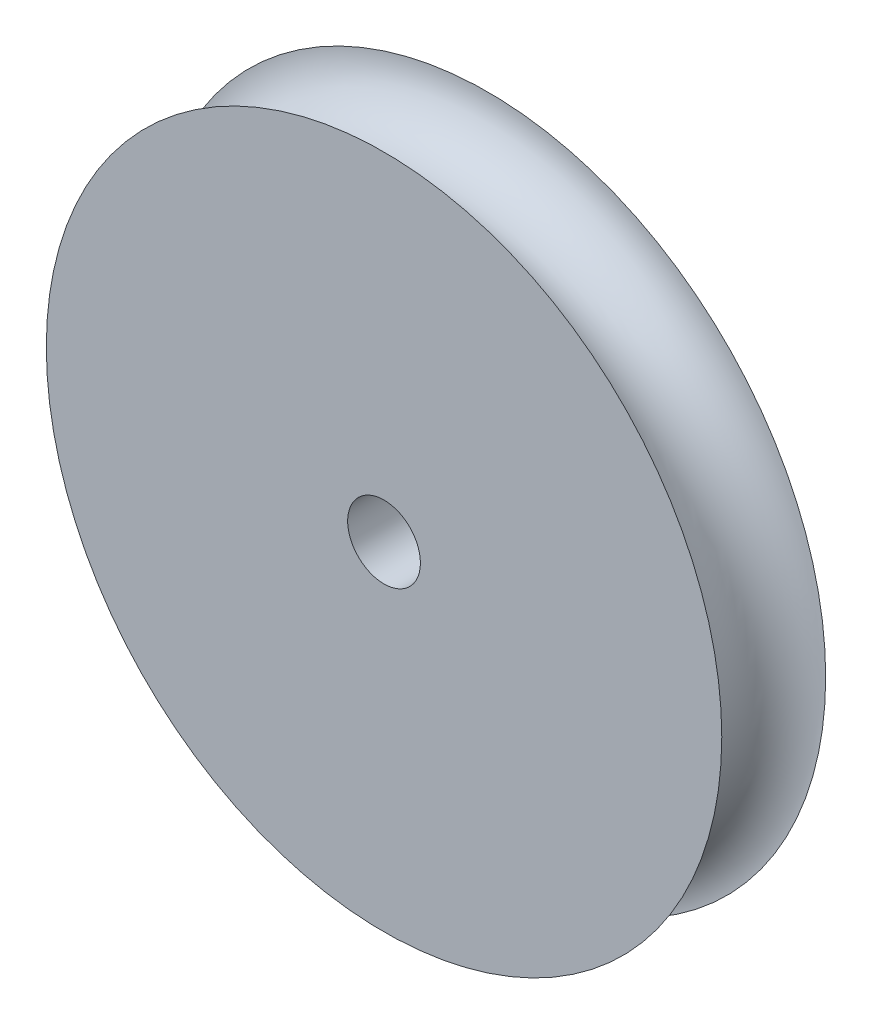
ISO-10303-21;
HEADER;
FILE_DESCRIPTION(('STEP AP214'),'2;1');
FILE_NAME('part.step','',(''),(''),'','','');
FILE_SCHEMA(('AUTOMOTIVE_DESIGN { 1 0 10303 214 1 1 1 1 }'));
ENDSEC;
DATA;
#1=APPLICATION_CONTEXT('core data for automotive mechanical design processes');
#2=APPLICATION_PROTOCOL_DEFINITION('international standard','automotive_design',2000,#1);
#3=PRODUCT_CONTEXT('',#1,'mechanical');
#4=PRODUCT('Part','Part','',(#3));
#5=PRODUCT_RELATED_PRODUCT_CATEGORY('part','',(#4));
#6=PRODUCT_DEFINITION_FORMATION('','',#4);
#7=PRODUCT_DEFINITION_CONTEXT('part definition',#1,'design');
#8=PRODUCT_DEFINITION('design','',#6,#7);
#9=PRODUCT_DEFINITION_SHAPE('','',#8);
#10=(LENGTH_UNIT() NAMED_UNIT(*) SI_UNIT(.MILLI.,.METRE.));
#11=(NAMED_UNIT(*) PLANE_ANGLE_UNIT() SI_UNIT($,.RADIAN.));
#12=(NAMED_UNIT(*) SI_UNIT($,.STERADIAN.) SOLID_ANGLE_UNIT());
#13=UNCERTAINTY_MEASURE_WITH_UNIT(LENGTH_MEASURE(1.E-05),#10,'distance_accuracy_value','');
#14=(GEOMETRIC_REPRESENTATION_CONTEXT(3) GLOBAL_UNCERTAINTY_ASSIGNED_CONTEXT((#13)) GLOBAL_UNIT_ASSIGNED_CONTEXT((#10,
#11,#12)) REPRESENTATION_CONTEXT('',''));
#15=CARTESIAN_POINT('',(0.,0.,0.));
#16=DIRECTION('',(0.,0.,1.));
#17=DIRECTION('',(1.,0.,0.));
#18=AXIS2_PLACEMENT_3D('',#15,#16,#17);
#19=CARTESIAN_POINT('',(61.7019830169732,380.98517873003,29.0273751903549));
#20=DIRECTION('',(0.,0.,1.));
#21=DIRECTION('',(1.,0.,0.));
#22=AXIS2_PLACEMENT_3D('',#19,#20,#21);
#23=PLANE('',#22);
#24=CARTESIAN_POINT('',(61.7019830169732,380.98517873003,29.0273751903549));
#25=DIRECTION('',(0.,0.,1.));
#26=DIRECTION('',(1.,0.,0.));
#27=AXIS2_PLACEMENT_3D('',#24,#25,#26);
#28=CIRCLE('',#27,3.50000000000001);
#29=CARTESIAN_POINT('',(65.2019830169732,380.98517873003,29.0273751903549));
#30=VERTEX_POINT('',#29);
#31=EDGE_CURVE('E45',#30,#30,#28,.T.);
#32=ORIENTED_EDGE('',*,*,#31,.F.);
#33=EDGE_LOOP('',(#32));
#34=FACE_BOUND('',#33,.T.);
#35=CARTESIAN_POINT('',(61.7019830169732,380.98517873003,29.0273751903549));
#36=DIRECTION('',(0.,0.,1.));
#37=DIRECTION('',(1.,0.,0.));
#38=AXIS2_PLACEMENT_3D('',#35,#36,#37);
#39=CIRCLE('',#38,32.5);
#40=CARTESIAN_POINT('',(94.2019830169732,380.98517873003,29.0273751903549));
#41=VERTEX_POINT('',#40);
#42=EDGE_CURVE('E10',#41,#41,#39,.T.);
#43=ORIENTED_EDGE('',*,*,#42,.T.);
#44=EDGE_LOOP('',(#43));
#45=FACE_BOUND('',#44,.T.);
#46=ADVANCED_FACE('F31',(#34,#45),#23,.T.);
#47=CARTESIAN_POINT('',(61.7019830169732,380.98517873003,24.0273751903549));
#48=DIRECTION('',(0.,0.,1.));
#49=DIRECTION('',(1.,0.,0.));
#50=AXIS2_PLACEMENT_3D('',#47,#48,#49);
#51=TOROIDAL_SURFACE('',#50,32.5000000000001,5.);
#52=CARTESIAN_POINT('',(61.7019830169732,380.98517873003,19.0273751903549));
#53=DIRECTION('',(0.,0.,1.));
#54=DIRECTION('',(1.,0.,0.));
#55=AXIS2_PLACEMENT_3D('',#52,#53,#54);
#56=CIRCLE('',#55,32.5);
#57=CARTESIAN_POINT('',(94.2019830169732,380.98517873003,19.0273751903549));
#58=VERTEX_POINT('',#57);
#59=EDGE_CURVE('E37',#58,#58,#56,.T.);
#60=ORIENTED_EDGE('',*,*,#59,.T.);
#61=EDGE_LOOP('',(#60));
#62=FACE_BOUND('',#61,.T.);
#63=ORIENTED_EDGE('',*,*,#42,.F.);
#64=EDGE_LOOP('',(#63));
#65=FACE_BOUND('',#64,.T.);
#66=ADVANCED_FACE('F54',(#62,#65),#51,.F.);
#67=CARTESIAN_POINT('',(61.7019830169732,380.98517873003,19.0273751903549));
#68=DIRECTION('',(0.,0.,-1.));
#69=DIRECTION('',(-1.,0.,0.));
#70=AXIS2_PLACEMENT_3D('',#67,#68,#69);
#71=PLANE('',#70);
#72=CARTESIAN_POINT('',(61.7019830169732,380.98517873003,19.0273751903549));
#73=DIRECTION('',(0.,0.,1.));
#74=DIRECTION('',(1.,0.,0.));
#75=AXIS2_PLACEMENT_3D('',#72,#73,#74);
#76=CIRCLE('',#75,3.50000000000001);
#77=CARTESIAN_POINT('',(65.2019830169732,380.98517873003,19.0273751903549));
#78=VERTEX_POINT('',#77);
#79=EDGE_CURVE('E41',#78,#78,#76,.T.);
#80=ORIENTED_EDGE('',*,*,#79,.T.);
#81=EDGE_LOOP('',(#80));
#82=FACE_BOUND('',#81,.T.);
#83=ORIENTED_EDGE('',*,*,#59,.F.);
#84=EDGE_LOOP('',(#83));
#85=FACE_BOUND('',#84,.T.);
#86=ADVANCED_FACE('F58',(#82,#85),#71,.T.);
#87=CARTESIAN_POINT('',(61.7019830169732,380.98517873003,19.0273751903549));
#88=DIRECTION('',(0.,0.,1.));
#89=DIRECTION('',(1.,0.,0.));
#90=AXIS2_PLACEMENT_3D('',#87,#88,#89);
#91=CYLINDRICAL_SURFACE('',#90,3.50000000000001);
#92=ORIENTED_EDGE('',*,*,#79,.F.);
#93=EDGE_LOOP('',(#92));
#94=FACE_BOUND('',#93,.T.);
#95=ORIENTED_EDGE('',*,*,#31,.T.);
#96=EDGE_LOOP('',(#95));
#97=FACE_BOUND('',#96,.T.);
#98=ADVANCED_FACE('F51',(#94,#97),#91,.F.);
#99=CLOSED_SHELL('',(#46,#66,#86,#98));
#100=MANIFOLD_SOLID_BREP('B2',#99);
#101=ADVANCED_BREP_SHAPE_REPRESENTATION('',(#18,#100),#14);
#102=SHAPE_DEFINITION_REPRESENTATION(#9,#101);
ENDSEC;
END-ISO-10303-21;
